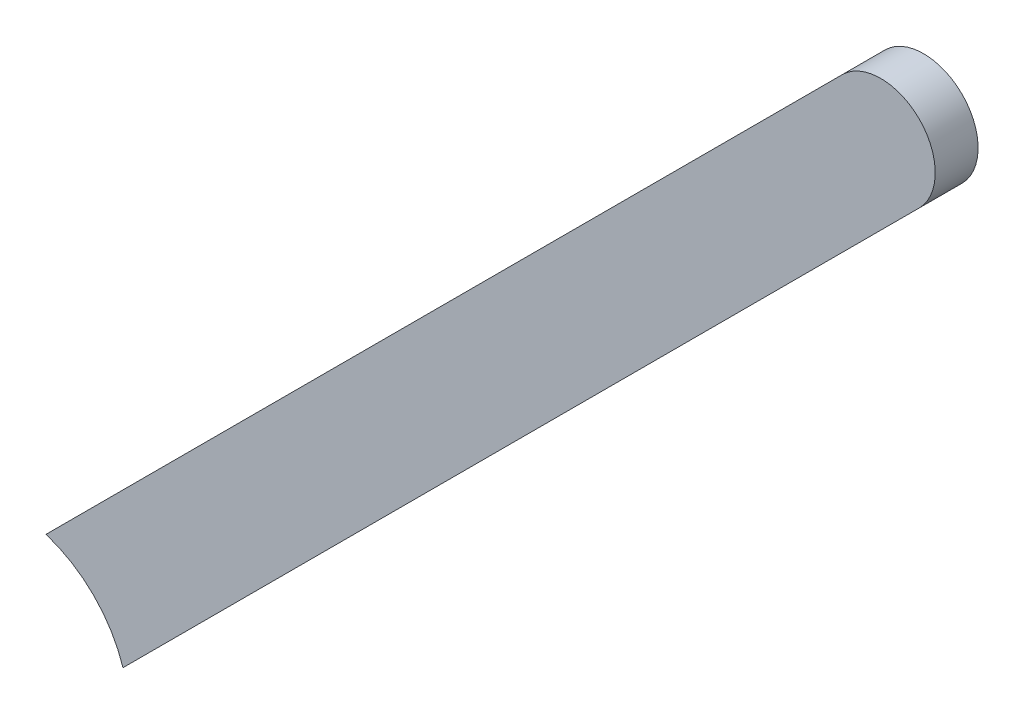
ISO-10303-21;
HEADER;
FILE_DESCRIPTION(('STEP AP214'),'2;1');
FILE_NAME('part.step','',(''),(''),'','','');
FILE_SCHEMA(('AUTOMOTIVE_DESIGN { 1 0 10303 214 1 1 1 1 }'));
ENDSEC;
DATA;
#1=APPLICATION_CONTEXT('core data for automotive mechanical design processes');
#2=APPLICATION_PROTOCOL_DEFINITION('international standard','automotive_design',2000,#1);
#3=PRODUCT_CONTEXT('',#1,'mechanical');
#4=PRODUCT('Part','Part','',(#3));
#5=PRODUCT_RELATED_PRODUCT_CATEGORY('part','',(#4));
#6=PRODUCT_DEFINITION_FORMATION('','',#4);
#7=PRODUCT_DEFINITION_CONTEXT('part definition',#1,'design');
#8=PRODUCT_DEFINITION('design','',#6,#7);
#9=PRODUCT_DEFINITION_SHAPE('','',#8);
#10=(LENGTH_UNIT() NAMED_UNIT(*) SI_UNIT(.MILLI.,.METRE.));
#11=(NAMED_UNIT(*) PLANE_ANGLE_UNIT() SI_UNIT($,.RADIAN.));
#12=(NAMED_UNIT(*) SI_UNIT($,.STERADIAN.) SOLID_ANGLE_UNIT());
#13=UNCERTAINTY_MEASURE_WITH_UNIT(LENGTH_MEASURE(1.E-05),#10,'distance_accuracy_value','');
#14=(GEOMETRIC_REPRESENTATION_CONTEXT(3) GLOBAL_UNCERTAINTY_ASSIGNED_CONTEXT((#13)) GLOBAL_UNIT_ASSIGNED_CONTEXT((#10,
#11,#12)) REPRESENTATION_CONTEXT('',''));
#15=CARTESIAN_POINT('',(0.,0.,0.));
#16=DIRECTION('',(0.,0.,1.));
#17=DIRECTION('',(1.,0.,0.));
#18=AXIS2_PLACEMENT_3D('',#15,#16,#17);
#19=CARTESIAN_POINT('',(129.553274621144,109.008327141144,0.));
#20=DIRECTION('',(-0.707106781186549,0.707106781186546,0.));
#21=DIRECTION('',(0.707106781186546,0.707106781186549,0.));
#22=AXIS2_PLACEMENT_3D('',#19,#20,#21);
#23=PLANE('',#22);
#24=DIRECTION('',(0.707106781186546,0.707106781186549,0.));
#25=VECTOR('',#24,1.);
#26=CARTESIAN_POINT('',(129.20434154,108.65939406,0.1999996));
#27=LINE('',#26,#25);
#28=CARTESIAN_POINT('',(129.553274621144,109.008327141144,0.1999996));
#29=VERTEX_POINT('',#28);
#30=CARTESIAN_POINT('',(133.26834154,112.72339406,0.1999996));
#31=VERTEX_POINT('',#30);
#32=EDGE_CURVE('E11',#29,#31,#27,.T.);
#33=ORIENTED_EDGE('',*,*,#32,.F.);
#34=DIRECTION('',(0.,0.,1.));
#35=VECTOR('',#34,1.);
#36=CARTESIAN_POINT('',(129.553274621144,109.008327141144,0.));
#37=LINE('',#36,#35);
#38=CARTESIAN_POINT('',(129.553274621144,109.008327141144,0.));
#39=VERTEX_POINT('',#38);
#40=EDGE_CURVE('E24',#39,#29,#37,.T.);
#41=ORIENTED_EDGE('',*,*,#40,.F.);
#42=DIRECTION('',(0.707106781186546,0.707106781186549,0.));
#43=VECTOR('',#42,1.);
#44=CARTESIAN_POINT('',(129.20434154,108.65939406,0.));
#45=LINE('',#44,#43);
#46=CARTESIAN_POINT('',(133.26834154,112.72339406,0.));
#47=VERTEX_POINT('',#46);
#48=EDGE_CURVE('E75',#39,#47,#45,.T.);
#49=ORIENTED_EDGE('',*,*,#48,.T.);
#50=DIRECTION('',(0.,0.,1.));
#51=VECTOR('',#50,1.);
#52=CARTESIAN_POINT('',(133.26834154,112.72339406,0.));
#53=LINE('',#52,#51);
#54=EDGE_CURVE('E37',#47,#31,#53,.T.);
#55=ORIENTED_EDGE('',*,*,#54,.T.);
#56=EDGE_LOOP('',(#33,#41,#49,#55));
#57=FACE_BOUND('',#56,.T.);
#58=ADVANCED_FACE('F17',(#57),#23,.F.);
#59=CARTESIAN_POINT('',(133.0887356,112.903,0.));
#60=DIRECTION('',(0.,0.,-1.));
#61=DIRECTION('',(0.70710678118652,-0.707106781186576,0.));
#62=AXIS2_PLACEMENT_3D('',#59,#60,#61);
#63=CYLINDRICAL_SURFACE('',#62,0.254001156230768);
#64=CARTESIAN_POINT('',(133.0887356,112.903,0.1999996));
#65=DIRECTION('',(0.,0.,1.));
#66=DIRECTION('',(0.70710678118652,-0.707106781186576,0.));
#67=AXIS2_PLACEMENT_3D('',#64,#65,#66);
#68=CIRCLE('',#67,0.254001156230768);
#69=CARTESIAN_POINT('',(132.90912966,113.08260594,0.1999996));
#70=VERTEX_POINT('',#69);
#71=EDGE_CURVE('E83',#31,#70,#68,.T.);
#72=ORIENTED_EDGE('',*,*,#71,.F.);
#73=ORIENTED_EDGE('',*,*,#54,.F.);
#74=CARTESIAN_POINT('',(133.0887356,112.903,0.));
#75=DIRECTION('',(0.,0.,1.));
#76=DIRECTION('',(0.70710678118652,-0.707106781186576,0.));
#77=AXIS2_PLACEMENT_3D('',#74,#75,#76);
#78=CIRCLE('',#77,0.254001156230768);
#79=CARTESIAN_POINT('',(132.90912966,113.08260594,0.));
#80=VERTEX_POINT('',#79);
#81=EDGE_CURVE('E81',#47,#80,#78,.T.);
#82=ORIENTED_EDGE('',*,*,#81,.T.);
#83=DIRECTION('',(0.,0.,1.));
#84=VECTOR('',#83,1.);
#85=CARTESIAN_POINT('',(132.90912966,113.08260594,0.));
#86=LINE('',#85,#84);
#87=EDGE_CURVE('E67',#80,#70,#86,.T.);
#88=ORIENTED_EDGE('',*,*,#87,.T.);
#89=EDGE_LOOP('',(#72,#73,#82,#88));
#90=FACE_BOUND('',#89,.T.);
#91=ADVANCED_FACE('F89',(#90),#63,.T.);
#92=CARTESIAN_POINT('',(132.90912966,113.08260594,0.));
#93=DIRECTION('',(0.707106781186549,-0.707106781186546,0.));
#94=DIRECTION('',(-0.707106781186546,-0.707106781186549,0.));
#95=AXIS2_PLACEMENT_3D('',#92,#93,#94);
#96=PLANE('',#95);
#97=DIRECTION('',(-0.707106781186546,-0.707106781186549,0.));
#98=VECTOR('',#97,1.);
#99=CARTESIAN_POINT('',(132.90912966,113.08260594,0.1999996));
#100=LINE('',#99,#98);
#101=CARTESIAN_POINT('',(129.194062741144,109.367539021144,0.1999996));
#102=VERTEX_POINT('',#101);
#103=EDGE_CURVE('E71',#70,#102,#100,.T.);
#104=ORIENTED_EDGE('',*,*,#103,.F.);
#105=ORIENTED_EDGE('',*,*,#87,.F.);
#106=DIRECTION('',(-0.707106781186546,-0.707106781186549,0.));
#107=VECTOR('',#106,1.);
#108=CARTESIAN_POINT('',(132.90912966,113.08260594,0.));
#109=LINE('',#108,#107);
#110=CARTESIAN_POINT('',(129.194062741144,109.367539021144,0.));
#111=VERTEX_POINT('',#110);
#112=EDGE_CURVE('E63',#80,#111,#109,.T.);
#113=ORIENTED_EDGE('',*,*,#112,.T.);
#114=DIRECTION('',(0.,0.,1.));
#115=VECTOR('',#114,1.);
#116=CARTESIAN_POINT('',(129.194062741144,109.367539021144,0.));
#117=LINE('',#116,#115);
#118=EDGE_CURVE('E53',#111,#102,#117,.T.);
#119=ORIENTED_EDGE('',*,*,#118,.T.);
#120=EDGE_LOOP('',(#104,#105,#113,#119));
#121=FACE_BOUND('',#120,.T.);
#122=ADVANCED_FACE('F66',(#121),#96,.F.);
#123=CARTESIAN_POINT('',(129.0247356,108.839,0.));
#124=DIRECTION('',(0.,0.,-1.));
#125=DIRECTION('',(1.,0.,0.));
#126=AXIS2_PLACEMENT_3D('',#123,#124,#125);
#127=CYLINDRICAL_SURFACE('',#126,0.55500016);
#128=ORIENTED_EDGE('',*,*,#40,.T.);
#129=CARTESIAN_POINT('',(129.0247356,108.839,0.1999996));
#130=DIRECTION('',(0.,0.,1.));
#131=DIRECTION('',(1.,0.,0.));
#132=AXIS2_PLACEMENT_3D('',#129,#130,#131);
#133=CIRCLE('',#132,0.55500016);
#134=EDGE_CURVE('E59',#29,#102,#133,.T.);
#135=ORIENTED_EDGE('',*,*,#134,.T.);
#136=ORIENTED_EDGE('',*,*,#118,.F.);
#137=CARTESIAN_POINT('',(129.0247356,108.839,0.));
#138=DIRECTION('',(0.,0.,1.));
#139=DIRECTION('',(1.,0.,0.));
#140=AXIS2_PLACEMENT_3D('',#137,#138,#139);
#141=CIRCLE('',#140,0.55500016);
#142=EDGE_CURVE('E57',#39,#111,#141,.T.);
#143=ORIENTED_EDGE('',*,*,#142,.F.);
#144=EDGE_LOOP('',(#128,#135,#136,#143));
#145=FACE_BOUND('',#144,.T.);
#146=ADVANCED_FACE('F55',(#145),#127,.F.);
#147=CARTESIAN_POINT('',(129.20434154,108.65939406,0.));
#148=DIRECTION('',(0.,0.,-1.));
#149=DIRECTION('',(-1.,0.,0.));
#150=AXIS2_PLACEMENT_3D('',#147,#148,#149);
#151=PLANE('',#150);
#152=ORIENTED_EDGE('',*,*,#48,.F.);
#153=ORIENTED_EDGE('',*,*,#142,.T.);
#154=ORIENTED_EDGE('',*,*,#112,.F.);
#155=ORIENTED_EDGE('',*,*,#81,.F.);
#156=EDGE_LOOP('',(#152,#153,#154,#155));
#157=FACE_BOUND('',#156,.T.);
#158=ADVANCED_FACE('F74',(#157),#151,.T.);
#159=CARTESIAN_POINT('',(129.20434154,108.65939406,0.1999996));
#160=DIRECTION('',(0.,0.,-1.));
#161=DIRECTION('',(-1.,0.,0.));
#162=AXIS2_PLACEMENT_3D('',#159,#160,#161);
#163=PLANE('',#162);
#164=ORIENTED_EDGE('',*,*,#134,.F.);
#165=ORIENTED_EDGE('',*,*,#32,.T.);
#166=ORIENTED_EDGE('',*,*,#71,.T.);
#167=ORIENTED_EDGE('',*,*,#103,.T.);
#168=EDGE_LOOP('',(#164,#165,#166,#167));
#169=FACE_BOUND('',#168,.T.);
#170=ADVANCED_FACE('F91',(#169),#163,.F.);
#171=CLOSED_SHELL('',(#58,#91,#122,#146,#158,#170));
#172=MANIFOLD_SOLID_BREP('B1',#171);
#173=ADVANCED_BREP_SHAPE_REPRESENTATION('',(#18,#172),#14);
#174=SHAPE_DEFINITION_REPRESENTATION(#9,#173);
ENDSEC;
END-ISO-10303-21;
